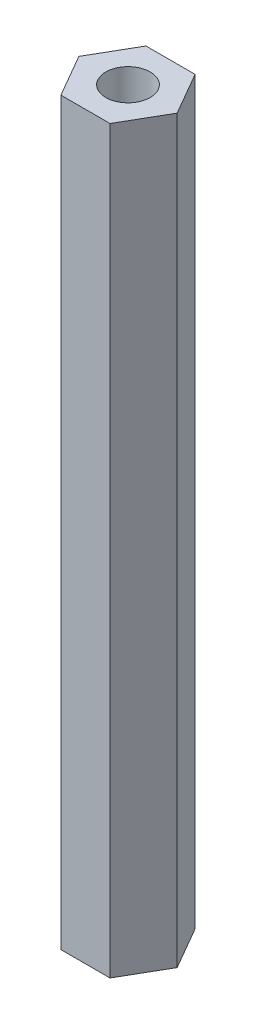
ISO-10303-21;
HEADER;
FILE_DESCRIPTION(('STEP AP214'),'2;1');
FILE_NAME('part.step','',(''),(''),'','','');
FILE_SCHEMA(('AUTOMOTIVE_DESIGN { 1 0 10303 214 1 1 1 1 }'));
ENDSEC;
DATA;
#1=APPLICATION_CONTEXT('core data for automotive mechanical design processes');
#2=APPLICATION_PROTOCOL_DEFINITION('international standard','automotive_design',2000,#1);
#3=PRODUCT_CONTEXT('',#1,'mechanical');
#4=PRODUCT('Part','Part','',(#3));
#5=PRODUCT_RELATED_PRODUCT_CATEGORY('part','',(#4));
#6=PRODUCT_DEFINITION_FORMATION('','',#4);
#7=PRODUCT_DEFINITION_CONTEXT('part definition',#1,'design');
#8=PRODUCT_DEFINITION('design','',#6,#7);
#9=PRODUCT_DEFINITION_SHAPE('','',#8);
#10=(LENGTH_UNIT() NAMED_UNIT(*) SI_UNIT(.MILLI.,.METRE.));
#11=(NAMED_UNIT(*) PLANE_ANGLE_UNIT() SI_UNIT($,.RADIAN.));
#12=(NAMED_UNIT(*) SI_UNIT($,.STERADIAN.) SOLID_ANGLE_UNIT());
#13=UNCERTAINTY_MEASURE_WITH_UNIT(LENGTH_MEASURE(1.E-05),#10,'distance_accuracy_value','');
#14=(GEOMETRIC_REPRESENTATION_CONTEXT(3) GLOBAL_UNCERTAINTY_ASSIGNED_CONTEXT((#13)) GLOBAL_UNIT_ASSIGNED_CONTEXT((#10,
#11,#12)) REPRESENTATION_CONTEXT('',''));
#15=CARTESIAN_POINT('',(0.,0.,0.));
#16=DIRECTION('',(0.,0.,1.));
#17=DIRECTION('',(1.,0.,0.));
#18=AXIS2_PLACEMENT_3D('',#15,#16,#17);
#19=CARTESIAN_POINT('',(0.,40.,0.));
#20=DIRECTION('',(0.,1.,0.));
#21=DIRECTION('',(0.,0.,1.));
#22=AXIS2_PLACEMENT_3D('',#19,#20,#21);
#23=PLANE('',#22);
#24=DIRECTION('',(0.499999999999995,0.,-0.866025403784442));
#25=VECTOR('',#24,1.);
#26=CARTESIAN_POINT('',(1.32790561913616,40.,2.29999999999998));
#27=LINE('',#26,#25);
#28=CARTESIAN_POINT('',(1.32790561913616,40.,2.29999999999998));
#29=VERTEX_POINT('',#28);
#30=CARTESIAN_POINT('',(2.65581123827227,40.,0.));
#31=VERTEX_POINT('',#30);
#32=EDGE_CURVE('E143',#29,#31,#27,.T.);
#33=ORIENTED_EDGE('',*,*,#32,.T.);
#34=DIRECTION('',(-0.500000000000001,0.,-0.866025403784438));
#35=VECTOR('',#34,1.);
#36=CARTESIAN_POINT('',(2.65581123827227,40.,0.));
#37=LINE('',#36,#35);
#38=CARTESIAN_POINT('',(1.32790561913613,40.,-2.3));
#39=VERTEX_POINT('',#38);
#40=EDGE_CURVE('E101',#31,#39,#37,.T.);
#41=ORIENTED_EDGE('',*,*,#40,.T.);
#42=DIRECTION('',(-1.,0.,0.));
#43=VECTOR('',#42,1.);
#44=CARTESIAN_POINT('',(1.32790561913613,40.,-2.3));
#45=LINE('',#44,#43);
#46=CARTESIAN_POINT('',(-1.32790561913615,40.,-2.29999999999999));
#47=VERTEX_POINT('',#46);
#48=EDGE_CURVE('E114',#39,#47,#45,.T.);
#49=ORIENTED_EDGE('',*,*,#48,.T.);
#50=DIRECTION('',(-0.499999999999995,0.,0.866025403784442));
#51=VECTOR('',#50,1.);
#52=CARTESIAN_POINT('',(-1.32790561913615,40.,-2.29999999999999));
#53=LINE('',#52,#51);
#54=CARTESIAN_POINT('',(-2.65581123827227,40.,0.));
#55=VERTEX_POINT('',#54);
#56=EDGE_CURVE('E108',#47,#55,#53,.T.);
#57=ORIENTED_EDGE('',*,*,#56,.T.);
#58=DIRECTION('',(0.500000000000007,0.,0.866025403784435));
#59=VECTOR('',#58,1.);
#60=CARTESIAN_POINT('',(-2.65581123827227,40.,0.));
#61=LINE('',#60,#59);
#62=CARTESIAN_POINT('',(-1.32790561913612,40.,2.30000000000001));
#63=VERTEX_POINT('',#62);
#64=EDGE_CURVE('E112',#55,#63,#61,.T.);
#65=ORIENTED_EDGE('',*,*,#64,.T.);
#66=DIRECTION('',(1.,0.,0.));
#67=VECTOR('',#66,1.);
#68=CARTESIAN_POINT('',(-1.32790561913612,40.,2.30000000000001));
#69=LINE('',#68,#67);
#70=EDGE_CURVE('E64',#63,#29,#69,.T.);
#71=ORIENTED_EDGE('',*,*,#70,.T.);
#72=EDGE_LOOP('',(#33,#41,#49,#57,#65,#71));
#73=FACE_BOUND('',#72,.T.);
#74=CARTESIAN_POINT('',(0.,40.,0.));
#75=DIRECTION('',(0.,1.,0.));
#76=DIRECTION('',(0.,0.,1.));
#77=AXIS2_PLACEMENT_3D('',#74,#75,#76);
#78=CIRCLE('',#77,1.2);
#79=CARTESIAN_POINT('',(0.,40.,1.2));
#80=VERTEX_POINT('',#79);
#81=EDGE_CURVE('E136',#80,#80,#78,.T.);
#82=ORIENTED_EDGE('',*,*,#81,.F.);
#83=EDGE_LOOP('',(#82));
#84=FACE_BOUND('',#83,.T.);
#85=ADVANCED_FACE('F47',(#73,#84),#23,.T.);
#86=CARTESIAN_POINT('',(0.,0.,0.));
#87=DIRECTION('',(0.,1.,0.));
#88=DIRECTION('',(0.,0.,1.));
#89=AXIS2_PLACEMENT_3D('',#86,#87,#88);
#90=PLANE('',#89);
#91=DIRECTION('',(0.499999999999995,0.,-0.866025403784442));
#92=VECTOR('',#91,1.);
#93=CARTESIAN_POINT('',(1.32790561913616,0.,2.29999999999998));
#94=LINE('',#93,#92);
#95=CARTESIAN_POINT('',(1.32790561913616,0.,2.29999999999998));
#96=VERTEX_POINT('',#95);
#97=CARTESIAN_POINT('',(2.65581123827227,0.,0.));
#98=VERTEX_POINT('',#97);
#99=EDGE_CURVE('E132',#96,#98,#94,.T.);
#100=ORIENTED_EDGE('',*,*,#99,.F.);
#101=DIRECTION('',(1.,0.,0.));
#102=VECTOR('',#101,1.);
#103=CARTESIAN_POINT('',(-1.32790561913612,0.,2.30000000000001));
#104=LINE('',#103,#102);
#105=CARTESIAN_POINT('',(-1.32790561913612,0.,2.30000000000001));
#106=VERTEX_POINT('',#105);
#107=EDGE_CURVE('E93',#106,#96,#104,.T.);
#108=ORIENTED_EDGE('',*,*,#107,.F.);
#109=DIRECTION('',(0.500000000000007,0.,0.866025403784435));
#110=VECTOR('',#109,1.);
#111=CARTESIAN_POINT('',(-2.65581123827227,0.,0.));
#112=LINE('',#111,#110);
#113=CARTESIAN_POINT('',(-2.65581123827227,0.,0.));
#114=VERTEX_POINT('',#113);
#115=EDGE_CURVE('E87',#114,#106,#112,.T.);
#116=ORIENTED_EDGE('',*,*,#115,.F.);
#117=DIRECTION('',(-0.499999999999995,0.,0.866025403784442));
#118=VECTOR('',#117,1.);
#119=CARTESIAN_POINT('',(-1.32790561913615,0.,-2.29999999999999));
#120=LINE('',#119,#118);
#121=CARTESIAN_POINT('',(-1.32790561913615,0.,-2.29999999999999));
#122=VERTEX_POINT('',#121);
#123=EDGE_CURVE('E122',#122,#114,#120,.T.);
#124=ORIENTED_EDGE('',*,*,#123,.F.);
#125=DIRECTION('',(-1.,0.,0.));
#126=VECTOR('',#125,1.);
#127=CARTESIAN_POINT('',(1.32790561913613,0.,-2.3));
#128=LINE('',#127,#126);
#129=CARTESIAN_POINT('',(1.32790561913613,0.,-2.3));
#130=VERTEX_POINT('',#129);
#131=EDGE_CURVE('E138',#130,#122,#128,.T.);
#132=ORIENTED_EDGE('',*,*,#131,.F.);
#133=DIRECTION('',(-0.500000000000001,0.,-0.866025403784438));
#134=VECTOR('',#133,1.);
#135=CARTESIAN_POINT('',(2.65581123827227,0.,0.));
#136=LINE('',#135,#134);
#137=EDGE_CURVE('E135',#98,#130,#136,.T.);
#138=ORIENTED_EDGE('',*,*,#137,.F.);
#139=EDGE_LOOP('',(#100,#108,#116,#124,#132,#138));
#140=FACE_BOUND('',#139,.T.);
#141=CARTESIAN_POINT('',(0.,0.,0.));
#142=DIRECTION('',(0.,1.,0.));
#143=DIRECTION('',(0.,0.,1.));
#144=AXIS2_PLACEMENT_3D('',#141,#142,#143);
#145=CIRCLE('',#144,1.2);
#146=CARTESIAN_POINT('',(0.,0.,1.2));
#147=VERTEX_POINT('',#146);
#148=EDGE_CURVE('E236',#147,#147,#145,.T.);
#149=ORIENTED_EDGE('',*,*,#148,.T.);
#150=EDGE_LOOP('',(#149));
#151=FACE_BOUND('',#150,.T.);
#152=ADVANCED_FACE('F152',(#140,#151),#90,.F.);
#153=CARTESIAN_POINT('',(1.32790561913616,40.,2.29999999999998));
#154=DIRECTION('',(-0.866025403784442,0.,-0.499999999999995));
#155=DIRECTION('',(-0.499999999999995,0.,0.866025403784442));
#156=AXIS2_PLACEMENT_3D('',#153,#154,#155);
#157=PLANE('',#156);
#158=ORIENTED_EDGE('',*,*,#99,.T.);
#159=DIRECTION('',(0.,-1.,0.));
#160=VECTOR('',#159,1.);
#161=CARTESIAN_POINT('',(2.65581123827227,40.,0.));
#162=LINE('',#161,#160);
#163=EDGE_CURVE('E13',#31,#98,#162,.T.);
#164=ORIENTED_EDGE('',*,*,#163,.F.);
#165=ORIENTED_EDGE('',*,*,#32,.F.);
#166=DIRECTION('',(0.,-1.,0.));
#167=VECTOR('',#166,1.);
#168=CARTESIAN_POINT('',(1.32790561913616,40.,2.29999999999998));
#169=LINE('',#168,#167);
#170=EDGE_CURVE('E128',#29,#96,#169,.T.);
#171=ORIENTED_EDGE('',*,*,#170,.T.);
#172=EDGE_LOOP('',(#158,#164,#165,#171));
#173=FACE_BOUND('',#172,.T.);
#174=ADVANCED_FACE('F49',(#173),#157,.F.);
#175=CARTESIAN_POINT('',(2.65581123827227,40.,0.));
#176=DIRECTION('',(-0.866025403784438,0.,0.500000000000001));
#177=DIRECTION('',(0.500000000000001,0.,0.866025403784438));
#178=AXIS2_PLACEMENT_3D('',#175,#176,#177);
#179=PLANE('',#178);
#180=ORIENTED_EDGE('',*,*,#137,.T.);
#181=DIRECTION('',(0.,-1.,0.));
#182=VECTOR('',#181,1.);
#183=CARTESIAN_POINT('',(1.32790561913613,40.,-2.3));
#184=LINE('',#183,#182);
#185=EDGE_CURVE('E56',#39,#130,#184,.T.);
#186=ORIENTED_EDGE('',*,*,#185,.F.);
#187=ORIENTED_EDGE('',*,*,#40,.F.);
#188=ORIENTED_EDGE('',*,*,#163,.T.);
#189=EDGE_LOOP('',(#180,#186,#187,#188));
#190=FACE_BOUND('',#189,.T.);
#191=ADVANCED_FACE('F177',(#190),#179,.F.);
#192=CARTESIAN_POINT('',(1.32790561913613,40.,-2.3));
#193=DIRECTION('',(0.,0.,1.));
#194=DIRECTION('',(1.,0.,0.));
#195=AXIS2_PLACEMENT_3D('',#192,#193,#194);
#196=PLANE('',#195);
#197=ORIENTED_EDGE('',*,*,#131,.T.);
#198=DIRECTION('',(0.,-1.,0.));
#199=VECTOR('',#198,1.);
#200=CARTESIAN_POINT('',(-1.32790561913615,40.,-2.29999999999999));
#201=LINE('',#200,#199);
#202=EDGE_CURVE('E123',#47,#122,#201,.T.);
#203=ORIENTED_EDGE('',*,*,#202,.F.);
#204=ORIENTED_EDGE('',*,*,#48,.F.);
#205=ORIENTED_EDGE('',*,*,#185,.T.);
#206=EDGE_LOOP('',(#197,#203,#204,#205));
#207=FACE_BOUND('',#206,.T.);
#208=ADVANCED_FACE('F149',(#207),#196,.F.);
#209=CARTESIAN_POINT('',(-1.32790561913615,40.,-2.29999999999999));
#210=DIRECTION('',(0.866025403784442,0.,0.499999999999995));
#211=DIRECTION('',(0.499999999999995,0.,-0.866025403784442));
#212=AXIS2_PLACEMENT_3D('',#209,#210,#211);
#213=PLANE('',#212);
#214=ORIENTED_EDGE('',*,*,#123,.T.);
#215=DIRECTION('',(0.,-1.,0.));
#216=VECTOR('',#215,1.);
#217=CARTESIAN_POINT('',(-2.65581123827227,40.,0.));
#218=LINE('',#217,#216);
#219=EDGE_CURVE('E119',#55,#114,#218,.T.);
#220=ORIENTED_EDGE('',*,*,#219,.F.);
#221=ORIENTED_EDGE('',*,*,#56,.F.);
#222=ORIENTED_EDGE('',*,*,#202,.T.);
#223=EDGE_LOOP('',(#214,#220,#221,#222));
#224=FACE_BOUND('',#223,.T.);
#225=ADVANCED_FACE('F120',(#224),#213,.F.);
#226=CARTESIAN_POINT('',(-2.65581123827227,40.,0.));
#227=DIRECTION('',(0.866025403784435,0.,-0.500000000000007));
#228=DIRECTION('',(-0.500000000000007,0.,-0.866025403784435));
#229=AXIS2_PLACEMENT_3D('',#226,#227,#228);
#230=PLANE('',#229);
#231=ORIENTED_EDGE('',*,*,#115,.T.);
#232=DIRECTION('',(0.,-1.,0.));
#233=VECTOR('',#232,1.);
#234=CARTESIAN_POINT('',(-1.32790561913612,40.,2.30000000000001));
#235=LINE('',#234,#233);
#236=EDGE_CURVE('E124',#63,#106,#235,.T.);
#237=ORIENTED_EDGE('',*,*,#236,.F.);
#238=ORIENTED_EDGE('',*,*,#64,.F.);
#239=ORIENTED_EDGE('',*,*,#219,.T.);
#240=EDGE_LOOP('',(#231,#237,#238,#239));
#241=FACE_BOUND('',#240,.T.);
#242=ADVANCED_FACE('F126',(#241),#230,.F.);
#243=CARTESIAN_POINT('',(-1.32790561913612,40.,2.30000000000001));
#244=DIRECTION('',(0.,0.,-1.));
#245=DIRECTION('',(-1.,0.,0.));
#246=AXIS2_PLACEMENT_3D('',#243,#244,#245);
#247=PLANE('',#246);
#248=ORIENTED_EDGE('',*,*,#107,.T.);
#249=ORIENTED_EDGE('',*,*,#170,.F.);
#250=ORIENTED_EDGE('',*,*,#70,.F.);
#251=ORIENTED_EDGE('',*,*,#236,.T.);
#252=EDGE_LOOP('',(#248,#249,#250,#251));
#253=FACE_BOUND('',#252,.T.);
#254=ADVANCED_FACE('F157',(#253),#247,.F.);
#255=CARTESIAN_POINT('',(0.,40.,0.));
#256=DIRECTION('',(0.,-1.,0.));
#257=DIRECTION('',(0.,0.,-1.));
#258=AXIS2_PLACEMENT_3D('',#255,#256,#257);
#259=CYLINDRICAL_SURFACE('',#258,1.2);
#260=ORIENTED_EDGE('',*,*,#81,.T.);
#261=EDGE_LOOP('',(#260));
#262=FACE_BOUND('',#261,.T.);
#263=ORIENTED_EDGE('',*,*,#148,.F.);
#264=EDGE_LOOP('',(#263));
#265=FACE_BOUND('',#264,.T.);
#266=ADVANCED_FACE('F159',(#262,#265),#259,.F.);
#267=CLOSED_SHELL('',(#85,#152,#174,#191,#208,#225,#242,#254,#266));
#268=MANIFOLD_SOLID_BREP('B2',#267);
#269=ADVANCED_BREP_SHAPE_REPRESENTATION('',(#18,#268),#14);
#270=SHAPE_DEFINITION_REPRESENTATION(#9,#269);
ENDSEC;
END-ISO-10303-21;
